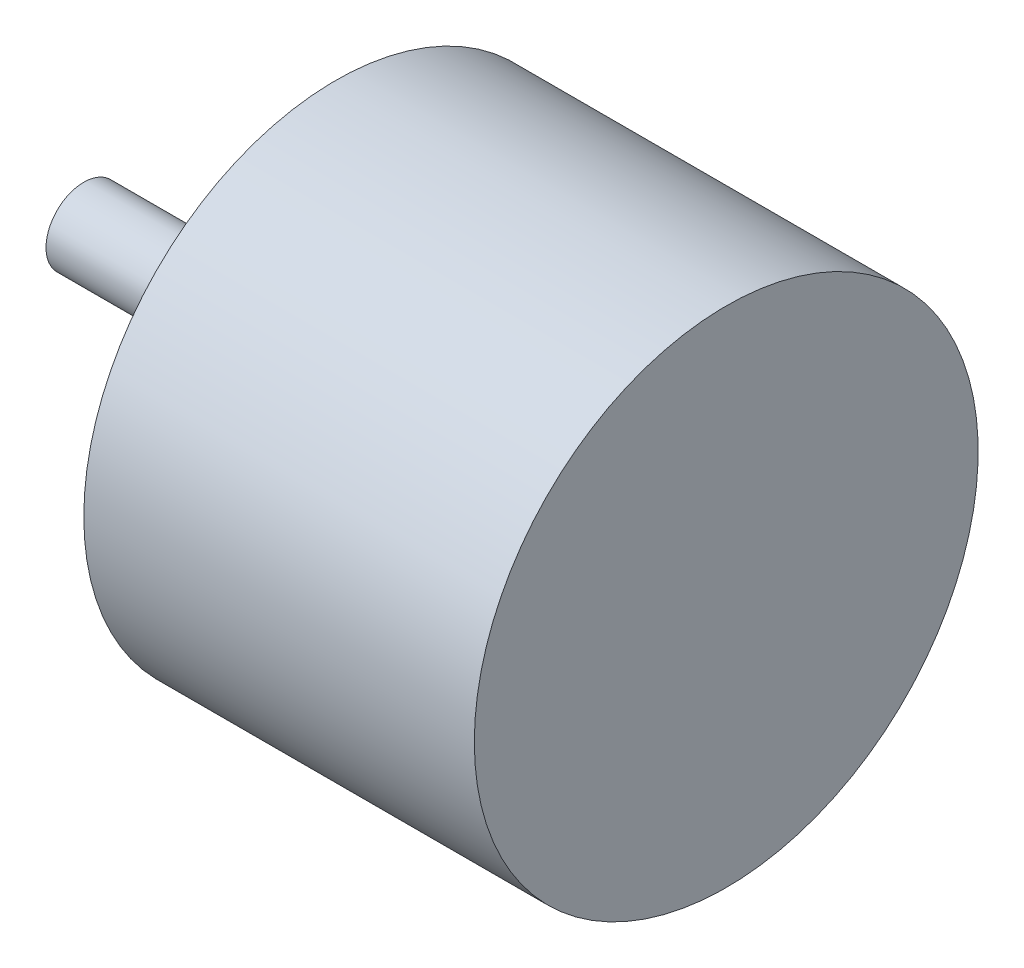
ISO-10303-21;
HEADER;
FILE_DESCRIPTION(('STEP AP214'),'2;1');
FILE_NAME('part.step','',(''),(''),'','','');
FILE_SCHEMA(('AUTOMOTIVE_DESIGN { 1 0 10303 214 1 1 1 1 }'));
ENDSEC;
DATA;
#1=APPLICATION_CONTEXT('core data for automotive mechanical design processes');
#2=APPLICATION_PROTOCOL_DEFINITION('international standard','automotive_design',2000,#1);
#3=PRODUCT_CONTEXT('',#1,'mechanical');
#4=PRODUCT('Part','Part','',(#3));
#5=PRODUCT_RELATED_PRODUCT_CATEGORY('part','',(#4));
#6=PRODUCT_DEFINITION_FORMATION('','',#4);
#7=PRODUCT_DEFINITION_CONTEXT('part definition',#1,'design');
#8=PRODUCT_DEFINITION('design','',#6,#7);
#9=PRODUCT_DEFINITION_SHAPE('','',#8);
#10=(LENGTH_UNIT() NAMED_UNIT(*) SI_UNIT(.MILLI.,.METRE.));
#11=(NAMED_UNIT(*) PLANE_ANGLE_UNIT() SI_UNIT($,.RADIAN.));
#12=(NAMED_UNIT(*) SI_UNIT($,.STERADIAN.) SOLID_ANGLE_UNIT());
#13=UNCERTAINTY_MEASURE_WITH_UNIT(LENGTH_MEASURE(1.E-05),#10,'distance_accuracy_value','');
#14=(GEOMETRIC_REPRESENTATION_CONTEXT(3) GLOBAL_UNCERTAINTY_ASSIGNED_CONTEXT((#13)) GLOBAL_UNIT_ASSIGNED_CONTEXT((#10,
#11,#12)) REPRESENTATION_CONTEXT('',''));
#15=CARTESIAN_POINT('',(0.,0.,0.));
#16=DIRECTION('',(0.,0.,1.));
#17=DIRECTION('',(1.,0.,0.));
#18=AXIS2_PLACEMENT_3D('',#15,#16,#17);
#19=CARTESIAN_POINT('',(-24.5,0.,0.));
#20=DIRECTION('',(1.,0.,0.));
#21=DIRECTION('',(0.,0.,-1.));
#22=AXIS2_PLACEMENT_3D('',#19,#20,#21);
#23=PLANE('',#22);
#24=CARTESIAN_POINT('',(-24.5,0.,0.));
#25=DIRECTION('',(-1.,0.,0.));
#26=DIRECTION('',(0.,0.,1.));
#27=AXIS2_PLACEMENT_3D('',#24,#25,#26);
#28=CIRCLE('',#27,3.);
#29=CARTESIAN_POINT('',(-24.5,0.,3.));
#30=VERTEX_POINT('',#29);
#31=EDGE_CURVE('E10',#30,#30,#28,.T.);
#32=ORIENTED_EDGE('',*,*,#31,.T.);
#33=EDGE_LOOP('',(#32));
#34=FACE_BOUND('',#33,.T.);
#35=ADVANCED_FACE('F45',(#34),#23,.F.);
#36=CARTESIAN_POINT('',(-28.1538461538462,0.,0.));
#37=DIRECTION('',(-1.,0.,0.));
#38=DIRECTION('',(0.,0.,1.));
#39=AXIS2_PLACEMENT_3D('',#36,#37,#38);
#40=CYLINDRICAL_SURFACE('',#39,3.);
#41=ORIENTED_EDGE('',*,*,#31,.F.);
#42=EDGE_LOOP('',(#41));
#43=FACE_BOUND('',#42,.T.);
#44=CARTESIAN_POINT('',(-9.50000000000001,0.,0.));
#45=DIRECTION('',(-1.,0.,0.));
#46=DIRECTION('',(0.,0.,1.));
#47=AXIS2_PLACEMENT_3D('',#44,#45,#46);
#48=CIRCLE('',#47,3.);
#49=CARTESIAN_POINT('',(-9.50000000000001,0.,3.));
#50=VERTEX_POINT('',#49);
#51=EDGE_CURVE('E51',#50,#50,#48,.T.);
#52=ORIENTED_EDGE('',*,*,#51,.T.);
#53=EDGE_LOOP('',(#52));
#54=FACE_BOUND('',#53,.T.);
#55=ADVANCED_FACE('F129',(#43,#54),#40,.T.);
#56=CARTESIAN_POINT('',(-9.50000000000001,3.,0.));
#57=DIRECTION('',(1.,0.,0.));
#58=DIRECTION('',(0.,0.,-1.));
#59=AXIS2_PLACEMENT_3D('',#56,#57,#58);
#60=PLANE('',#59);
#61=ORIENTED_EDGE('',*,*,#51,.F.);
#62=EDGE_LOOP('',(#61));
#63=FACE_BOUND('',#62,.T.);
#64=CARTESIAN_POINT('',(-9.50000000000001,0.,0.));
#65=DIRECTION('',(-1.,0.,0.));
#66=DIRECTION('',(0.,0.,1.));
#67=AXIS2_PLACEMENT_3D('',#64,#65,#66);
#68=CIRCLE('',#67,10.);
#69=CARTESIAN_POINT('',(-9.50000000000001,0.,10.));
#70=VERTEX_POINT('',#69);
#71=EDGE_CURVE('E55',#70,#70,#68,.T.);
#72=ORIENTED_EDGE('',*,*,#71,.T.);
#73=EDGE_LOOP('',(#72));
#74=FACE_BOUND('',#73,.T.);
#75=ADVANCED_FACE('F133',(#63,#74),#60,.F.);
#76=CARTESIAN_POINT('',(-28.1538461538462,0.,0.));
#77=DIRECTION('',(-1.,0.,0.));
#78=DIRECTION('',(0.,0.,1.));
#79=AXIS2_PLACEMENT_3D('',#76,#77,#78);
#80=CYLINDRICAL_SURFACE('',#79,10.);
#81=ORIENTED_EDGE('',*,*,#71,.F.);
#82=EDGE_LOOP('',(#81));
#83=FACE_BOUND('',#82,.T.);
#84=CARTESIAN_POINT('',(-4.5,0.,0.));
#85=DIRECTION('',(-1.,0.,0.));
#86=DIRECTION('',(0.,0.,1.));
#87=AXIS2_PLACEMENT_3D('',#84,#85,#86);
#88=CIRCLE('',#87,10.);
#89=CARTESIAN_POINT('',(-4.5,0.,10.));
#90=VERTEX_POINT('',#89);
#91=EDGE_CURVE('E59',#90,#90,#88,.T.);
#92=ORIENTED_EDGE('',*,*,#91,.T.);
#93=EDGE_LOOP('',(#92));
#94=FACE_BOUND('',#93,.T.);
#95=ADVANCED_FACE('F102',(#83,#94),#80,.T.);
#96=CARTESIAN_POINT('',(-4.50000000000001,10.,0.));
#97=DIRECTION('',(1.,0.,0.));
#98=DIRECTION('',(0.,0.,-1.));
#99=AXIS2_PLACEMENT_3D('',#96,#97,#98);
#100=PLANE('',#99);
#101=CARTESIAN_POINT('',(-4.50000000000001,0.,15.));
#102=DIRECTION('',(-1.,0.,0.));
#103=DIRECTION('',(0.,0.,1.));
#104=AXIS2_PLACEMENT_3D('',#101,#102,#103);
#105=CIRCLE('',#104,1.5);
#106=CARTESIAN_POINT('',(-4.50000000000001,0.,16.5));
#107=VERTEX_POINT('',#106);
#108=EDGE_CURVE('E83',#107,#107,#105,.T.);
#109=ORIENTED_EDGE('',*,*,#108,.F.);
#110=EDGE_LOOP('',(#109));
#111=FACE_BOUND('',#110,.T.);
#112=CARTESIAN_POINT('',(-4.50000000000001,-12.9903810567665,-7.50000000000006));
#113=DIRECTION('',(-1.,0.,0.));
#114=DIRECTION('',(0.,0.,1.));
#115=AXIS2_PLACEMENT_3D('',#112,#113,#114);
#116=CIRCLE('',#115,1.5);
#117=CARTESIAN_POINT('',(-4.50000000000001,-12.9903810567665,-6.00000000000006));
#118=VERTEX_POINT('',#117);
#119=EDGE_CURVE('E80',#118,#118,#116,.T.);
#120=ORIENTED_EDGE('',*,*,#119,.F.);
#121=EDGE_LOOP('',(#120));
#122=FACE_BOUND('',#121,.T.);
#123=CARTESIAN_POINT('',(-4.50000000000001,12.9903810567667,-7.49999999999988));
#124=DIRECTION('',(-1.,0.,0.));
#125=DIRECTION('',(0.,0.,1.));
#126=AXIS2_PLACEMENT_3D('',#123,#124,#125);
#127=CIRCLE('',#126,1.5);
#128=CARTESIAN_POINT('',(-4.50000000000001,12.9903810567667,-5.99999999999988));
#129=VERTEX_POINT('',#128);
#130=EDGE_CURVE('E74',#129,#129,#127,.T.);
#131=ORIENTED_EDGE('',*,*,#130,.F.);
#132=EDGE_LOOP('',(#131));
#133=FACE_BOUND('',#132,.T.);
#134=ORIENTED_EDGE('',*,*,#91,.F.);
#135=EDGE_LOOP('',(#134));
#136=FACE_BOUND('',#135,.T.);
#137=CARTESIAN_POINT('',(-4.50000000000001,0.,0.));
#138=DIRECTION('',(-1.,0.,0.));
#139=DIRECTION('',(0.,0.,1.));
#140=AXIS2_PLACEMENT_3D('',#137,#138,#139);
#141=CIRCLE('',#140,20.);
#142=CARTESIAN_POINT('',(-4.50000000000001,0.,20.));
#143=VERTEX_POINT('',#142);
#144=EDGE_CURVE('E64',#143,#143,#141,.T.);
#145=ORIENTED_EDGE('',*,*,#144,.T.);
#146=EDGE_LOOP('',(#145));
#147=FACE_BOUND('',#146,.T.);
#148=ADVANCED_FACE('F98',(#111,#122,#133,#136,#147),#100,.F.);
#149=CARTESIAN_POINT('',(-28.1538461538462,0.,0.));
#150=DIRECTION('',(-1.,0.,0.));
#151=DIRECTION('',(0.,0.,1.));
#152=AXIS2_PLACEMENT_3D('',#149,#150,#151);
#153=CYLINDRICAL_SURFACE('',#152,20.);
#154=ORIENTED_EDGE('',*,*,#144,.F.);
#155=EDGE_LOOP('',(#154));
#156=FACE_BOUND('',#155,.T.);
#157=CARTESIAN_POINT('',(26.5,0.,0.));
#158=DIRECTION('',(-1.,0.,0.));
#159=DIRECTION('',(0.,0.,1.));
#160=AXIS2_PLACEMENT_3D('',#157,#158,#159);
#161=CIRCLE('',#160,20.);
#162=CARTESIAN_POINT('',(26.5,0.,20.));
#163=VERTEX_POINT('',#162);
#164=EDGE_CURVE('E67',#163,#163,#161,.T.);
#165=ORIENTED_EDGE('',*,*,#164,.T.);
#166=EDGE_LOOP('',(#165));
#167=FACE_BOUND('',#166,.T.);
#168=ADVANCED_FACE('F101',(#156,#167),#153,.T.);
#169=CARTESIAN_POINT('',(26.5,20.,0.));
#170=DIRECTION('',(-1.,0.,0.));
#171=DIRECTION('',(0.,0.,1.));
#172=AXIS2_PLACEMENT_3D('',#169,#170,#171);
#173=PLANE('',#172);
#174=ORIENTED_EDGE('',*,*,#164,.F.);
#175=EDGE_LOOP('',(#174));
#176=FACE_BOUND('',#175,.T.);
#177=ADVANCED_FACE('F114',(#176),#173,.F.);
#178=CARTESIAN_POINT('',(5.49999999999999,12.9903810567667,-7.49999999999988));
#179=DIRECTION('',(-1.,0.,0.));
#180=DIRECTION('',(0.,0.,1.));
#181=AXIS2_PLACEMENT_3D('',#178,#179,#180);
#182=CYLINDRICAL_SURFACE('',#181,1.5);
#183=CARTESIAN_POINT('',(5.49999999999999,12.9903810567667,-7.49999999999988));
#184=DIRECTION('',(-1.,0.,0.));
#185=DIRECTION('',(0.,0.,1.));
#186=AXIS2_PLACEMENT_3D('',#183,#184,#185);
#187=CIRCLE('',#186,1.5);
#188=CARTESIAN_POINT('',(5.49999999999999,12.9903810567667,-5.99999999999988));
#189=VERTEX_POINT('',#188);
#190=EDGE_CURVE('E71',#189,#189,#187,.T.);
#191=ORIENTED_EDGE('',*,*,#190,.F.);
#192=EDGE_LOOP('',(#191));
#193=FACE_BOUND('',#192,.T.);
#194=ORIENTED_EDGE('',*,*,#130,.T.);
#195=EDGE_LOOP('',(#194));
#196=FACE_BOUND('',#195,.T.);
#197=ADVANCED_FACE('F119',(#193,#196),#182,.F.);
#198=CARTESIAN_POINT('',(5.49999999999999,12.9903810567667,-7.49999999999988));
#199=DIRECTION('',(-1.,0.,0.));
#200=DIRECTION('',(0.,0.,1.));
#201=AXIS2_PLACEMENT_3D('',#198,#199,#200);
#202=PLANE('',#201);
#203=ORIENTED_EDGE('',*,*,#190,.T.);
#204=EDGE_LOOP('',(#203));
#205=FACE_BOUND('',#204,.T.);
#206=ADVANCED_FACE('F124',(#205),#202,.T.);
#207=CARTESIAN_POINT('',(5.49999999999999,-12.9903810567665,-7.50000000000006));
#208=DIRECTION('',(-1.,0.,0.));
#209=DIRECTION('',(0.,0.,1.));
#210=AXIS2_PLACEMENT_3D('',#207,#208,#209);
#211=CYLINDRICAL_SURFACE('',#210,1.5);
#212=CARTESIAN_POINT('',(5.49999999999999,-12.9903810567665,-7.50000000000006));
#213=DIRECTION('',(-1.,0.,0.));
#214=DIRECTION('',(0.,0.,1.));
#215=AXIS2_PLACEMENT_3D('',#212,#213,#214);
#216=CIRCLE('',#215,1.5);
#217=CARTESIAN_POINT('',(5.49999999999999,-12.9903810567665,-6.00000000000006));
#218=VERTEX_POINT('',#217);
#219=EDGE_CURVE('E77',#218,#218,#216,.T.);
#220=ORIENTED_EDGE('',*,*,#219,.F.);
#221=EDGE_LOOP('',(#220));
#222=FACE_BOUND('',#221,.T.);
#223=ORIENTED_EDGE('',*,*,#119,.T.);
#224=EDGE_LOOP('',(#223));
#225=FACE_BOUND('',#224,.T.);
#226=ADVANCED_FACE('F187',(#222,#225),#211,.F.);
#227=CARTESIAN_POINT('',(5.49999999999999,-12.9903810567665,-7.50000000000006));
#228=DIRECTION('',(-1.,0.,0.));
#229=DIRECTION('',(0.,0.,1.));
#230=AXIS2_PLACEMENT_3D('',#227,#228,#229);
#231=PLANE('',#230);
#232=ORIENTED_EDGE('',*,*,#219,.T.);
#233=EDGE_LOOP('',(#232));
#234=FACE_BOUND('',#233,.T.);
#235=ADVANCED_FACE('F94',(#234),#231,.T.);
#236=CARTESIAN_POINT('',(5.49999999999999,0.,15.));
#237=DIRECTION('',(-1.,0.,0.));
#238=DIRECTION('',(0.,0.,1.));
#239=AXIS2_PLACEMENT_3D('',#236,#237,#238);
#240=CYLINDRICAL_SURFACE('',#239,1.5);
#241=CARTESIAN_POINT('',(5.49999999999999,0.,15.));
#242=DIRECTION('',(-1.,0.,0.));
#243=DIRECTION('',(0.,0.,1.));
#244=AXIS2_PLACEMENT_3D('',#241,#242,#243);
#245=CIRCLE('',#244,1.5);
#246=CARTESIAN_POINT('',(5.49999999999999,0.,16.5));
#247=VERTEX_POINT('',#246);
#248=EDGE_CURVE('E70',#247,#247,#245,.T.);
#249=ORIENTED_EDGE('',*,*,#248,.F.);
#250=EDGE_LOOP('',(#249));
#251=FACE_BOUND('',#250,.T.);
#252=ORIENTED_EDGE('',*,*,#108,.T.);
#253=EDGE_LOOP('',(#252));
#254=FACE_BOUND('',#253,.T.);
#255=ADVANCED_FACE('F91',(#251,#254),#240,.F.);
#256=CARTESIAN_POINT('',(5.49999999999999,0.,15.));
#257=DIRECTION('',(-1.,0.,0.));
#258=DIRECTION('',(0.,0.,1.));
#259=AXIS2_PLACEMENT_3D('',#256,#257,#258);
#260=PLANE('',#259);
#261=ORIENTED_EDGE('',*,*,#248,.T.);
#262=EDGE_LOOP('',(#261));
#263=FACE_BOUND('',#262,.T.);
#264=ADVANCED_FACE('F89',(#263),#260,.T.);
#265=CLOSED_SHELL('',(#35,#55,#75,#95,#148,#168,#177,#197,#206,#226,#235,#255,#264));
#266=MANIFOLD_SOLID_BREP('B2',#265);
#267=ADVANCED_BREP_SHAPE_REPRESENTATION('',(#18,#266),#14);
#268=SHAPE_DEFINITION_REPRESENTATION(#9,#267);
ENDSEC;
END-ISO-10303-21;
